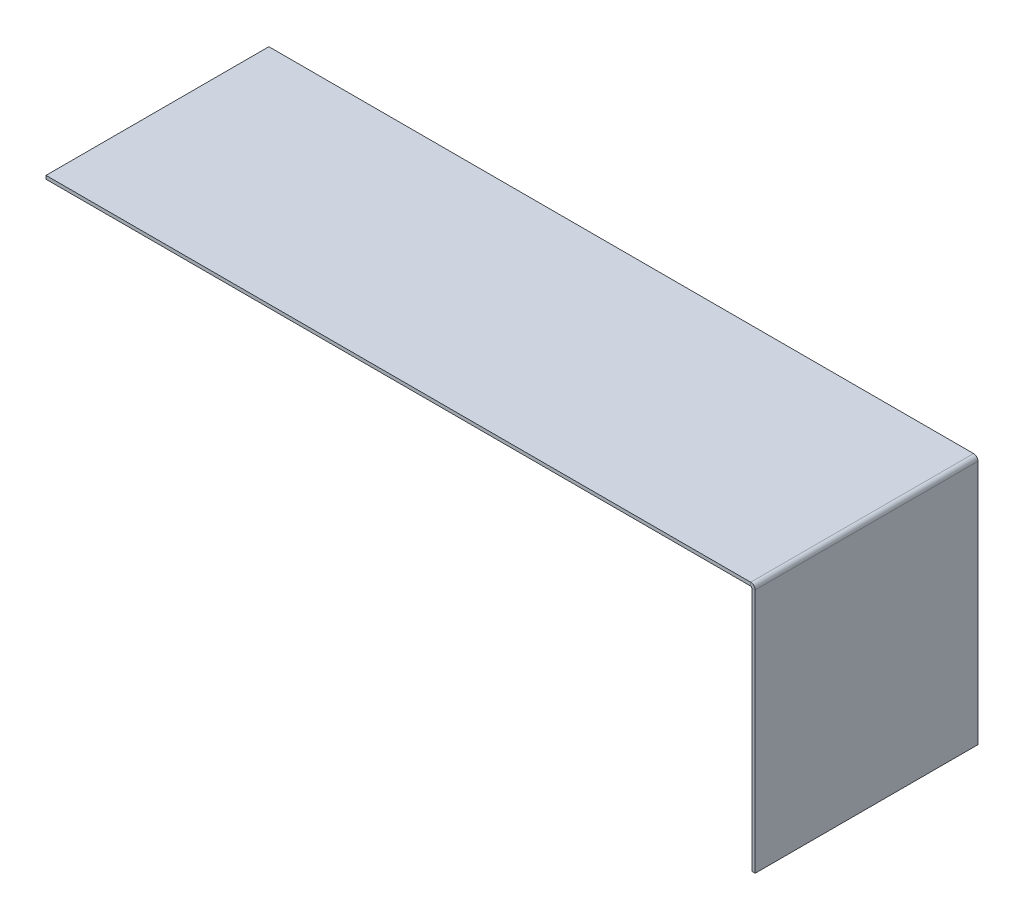
ISO-10303-21;
HEADER;
FILE_DESCRIPTION(('STEP AP214'),'2;1');
FILE_NAME('part.step','',(''),(''),'','','');
FILE_SCHEMA(('AUTOMOTIVE_DESIGN { 1 0 10303 214 1 1 1 1 }'));
ENDSEC;
DATA;
#1=APPLICATION_CONTEXT('core data for automotive mechanical design processes');
#2=APPLICATION_PROTOCOL_DEFINITION('international standard','automotive_design',2000,#1);
#3=PRODUCT_CONTEXT('',#1,'mechanical');
#4=PRODUCT('Part','Part','',(#3));
#5=PRODUCT_RELATED_PRODUCT_CATEGORY('part','',(#4));
#6=PRODUCT_DEFINITION_FORMATION('','',#4);
#7=PRODUCT_DEFINITION_CONTEXT('part definition',#1,'design');
#8=PRODUCT_DEFINITION('design','',#6,#7);
#9=PRODUCT_DEFINITION_SHAPE('','',#8);
#10=(LENGTH_UNIT() NAMED_UNIT(*) SI_UNIT(.MILLI.,.METRE.));
#11=(NAMED_UNIT(*) PLANE_ANGLE_UNIT() SI_UNIT($,.RADIAN.));
#12=(NAMED_UNIT(*) SI_UNIT($,.STERADIAN.) SOLID_ANGLE_UNIT());
#13=UNCERTAINTY_MEASURE_WITH_UNIT(LENGTH_MEASURE(1.E-05),#10,'distance_accuracy_value','');
#14=(GEOMETRIC_REPRESENTATION_CONTEXT(3) GLOBAL_UNCERTAINTY_ASSIGNED_CONTEXT((#13)) GLOBAL_UNIT_ASSIGNED_CONTEXT((#10,
#11,#12)) REPRESENTATION_CONTEXT('',''));
#15=CARTESIAN_POINT('',(0.,0.,0.));
#16=DIRECTION('',(0.,0.,1.));
#17=DIRECTION('',(1.,0.,0.));
#18=AXIS2_PLACEMENT_3D('',#15,#16,#17);
#19=CARTESIAN_POINT('',(666.75,-4.175,209.55));
#20=DIRECTION('',(0.,0.,1.));
#21=DIRECTION('',(1.,0.,0.));
#22=AXIS2_PLACEMENT_3D('',#19,#20,#21);
#23=PLANE('',#22);
#24=DIRECTION('',(-1.,0.,0.));
#25=VECTOR('',#24,1.);
#26=CARTESIAN_POINT('',(666.75,-4.175,209.55));
#27=LINE('',#26,#25);
#28=CARTESIAN_POINT('',(666.75,-4.175,209.55));
#29=VERTEX_POINT('',#28);
#30=CARTESIAN_POINT('',(663.575,-4.175,209.55));
#31=VERTEX_POINT('',#30);
#32=EDGE_CURVE('E11',#29,#31,#27,.T.);
#33=ORIENTED_EDGE('',*,*,#32,.F.);
#34=CARTESIAN_POINT('',(662.575,-4.175,209.55));
#35=DIRECTION('',(0.,0.,1.));
#36=DIRECTION('',(1.,0.,0.));
#37=AXIS2_PLACEMENT_3D('',#34,#35,#36);
#38=CIRCLE('',#37,4.175);
#39=CARTESIAN_POINT('',(662.575,0.,209.55));
#40=VERTEX_POINT('',#39);
#41=EDGE_CURVE('E131',#40,#29,#38,.F.);
#42=ORIENTED_EDGE('',*,*,#41,.F.);
#43=DIRECTION('',(0.,1.,0.));
#44=VECTOR('',#43,1.);
#45=CARTESIAN_POINT('',(662.575,-3.175,209.55));
#46=LINE('',#45,#44);
#47=CARTESIAN_POINT('',(662.575,-3.175,209.55));
#48=VERTEX_POINT('',#47);
#49=EDGE_CURVE('E42',#48,#40,#46,.T.);
#50=ORIENTED_EDGE('',*,*,#49,.F.);
#51=CARTESIAN_POINT('',(662.575,-4.175,209.55));
#52=DIRECTION('',(0.,0.,1.));
#53=DIRECTION('',(1.,0.,0.));
#54=AXIS2_PLACEMENT_3D('',#51,#52,#53);
#55=CIRCLE('',#54,1.);
#56=EDGE_CURVE('E124',#48,#31,#55,.F.);
#57=ORIENTED_EDGE('',*,*,#56,.T.);
#58=EDGE_LOOP('',(#33,#42,#50,#57));
#59=FACE_BOUND('',#58,.T.);
#60=ADVANCED_FACE('F34',(#59),#23,.T.);
#61=CARTESIAN_POINT('',(662.575,-3.175,209.55));
#62=DIRECTION('',(0.,0.,1.));
#63=DIRECTION('',(1.,0.,0.));
#64=AXIS2_PLACEMENT_3D('',#61,#62,#63);
#65=PLANE('',#64);
#66=DIRECTION('',(0.,-1.,0.));
#67=VECTOR('',#66,1.);
#68=CARTESIAN_POINT('',(666.75,0.,209.55));
#69=LINE('',#68,#67);
#70=CARTESIAN_POINT('',(666.75,-234.95,209.55));
#71=VERTEX_POINT('',#70);
#72=EDGE_CURVE('E180',#29,#71,#69,.T.);
#73=ORIENTED_EDGE('',*,*,#72,.F.);
#74=ORIENTED_EDGE('',*,*,#32,.T.);
#75=DIRECTION('',(0.,1.,0.));
#76=VECTOR('',#75,1.);
#77=CARTESIAN_POINT('',(663.575,0.,209.55));
#78=LINE('',#77,#76);
#79=CARTESIAN_POINT('',(663.575,-234.95,209.55));
#80=VERTEX_POINT('',#79);
#81=EDGE_CURVE('E90',#31,#80,#78,.F.);
#82=ORIENTED_EDGE('',*,*,#81,.T.);
#83=DIRECTION('',(-1.,0.,0.));
#84=VECTOR('',#83,1.);
#85=CARTESIAN_POINT('',(666.75,-234.95,209.55));
#86=LINE('',#85,#84);
#87=EDGE_CURVE('E337',#71,#80,#86,.T.);
#88=ORIENTED_EDGE('',*,*,#87,.F.);
#89=EDGE_LOOP('',(#73,#74,#82,#88));
#90=FACE_BOUND('',#89,.T.);
#91=ADVANCED_FACE('F188',(#90),#65,.T.);
#92=CARTESIAN_POINT('',(662.575,0.,0.));
#93=DIRECTION('',(0.,0.,-1.));
#94=DIRECTION('',(-1.,0.,0.));
#95=AXIS2_PLACEMENT_3D('',#92,#93,#94);
#96=PLANE('',#95);
#97=DIRECTION('',(0.,-1.,0.));
#98=VECTOR('',#97,1.);
#99=CARTESIAN_POINT('',(662.575,0.,0.));
#100=LINE('',#99,#98);
#101=CARTESIAN_POINT('',(662.575,0.,0.));
#102=VERTEX_POINT('',#101);
#103=CARTESIAN_POINT('',(662.575,-3.175,0.));
#104=VERTEX_POINT('',#103);
#105=EDGE_CURVE('E77',#102,#104,#100,.T.);
#106=ORIENTED_EDGE('',*,*,#105,.F.);
#107=CARTESIAN_POINT('',(662.575,-4.175,0.));
#108=DIRECTION('',(0.,0.,1.));
#109=DIRECTION('',(1.,0.,0.));
#110=AXIS2_PLACEMENT_3D('',#107,#108,#109);
#111=CIRCLE('',#110,4.175);
#112=CARTESIAN_POINT('',(666.75,-4.175,0.));
#113=VERTEX_POINT('',#112);
#114=EDGE_CURVE('E146',#102,#113,#111,.F.);
#115=ORIENTED_EDGE('',*,*,#114,.T.);
#116=DIRECTION('',(1.,0.,0.));
#117=VECTOR('',#116,1.);
#118=CARTESIAN_POINT('',(663.575,-4.175,0.));
#119=LINE('',#118,#117);
#120=CARTESIAN_POINT('',(663.575,-4.175,0.));
#121=VERTEX_POINT('',#120);
#122=EDGE_CURVE('E84',#121,#113,#119,.T.);
#123=ORIENTED_EDGE('',*,*,#122,.F.);
#124=CARTESIAN_POINT('',(662.575,-4.175,0.));
#125=DIRECTION('',(0.,0.,1.));
#126=DIRECTION('',(1.,0.,0.));
#127=AXIS2_PLACEMENT_3D('',#124,#125,#126);
#128=CIRCLE('',#127,1.);
#129=EDGE_CURVE('E153',#104,#121,#128,.F.);
#130=ORIENTED_EDGE('',*,*,#129,.F.);
#131=EDGE_LOOP('',(#106,#115,#123,#130));
#132=FACE_BOUND('',#131,.T.);
#133=ADVANCED_FACE('F186',(#132),#96,.T.);
#134=CARTESIAN_POINT('',(663.575,-4.175,0.));
#135=DIRECTION('',(0.,0.,-1.));
#136=DIRECTION('',(-1.,0.,0.));
#137=AXIS2_PLACEMENT_3D('',#134,#135,#136);
#138=PLANE('',#137);
#139=DIRECTION('',(1.,0.,0.));
#140=VECTOR('',#139,1.);
#141=CARTESIAN_POINT('',(0.,0.,0.));
#142=LINE('',#141,#140);
#143=CARTESIAN_POINT('',(0.,0.,0.));
#144=VERTEX_POINT('',#143);
#145=EDGE_CURVE('E148',#144,#102,#142,.T.);
#146=ORIENTED_EDGE('',*,*,#145,.T.);
#147=ORIENTED_EDGE('',*,*,#105,.T.);
#148=DIRECTION('',(1.,0.,0.));
#149=VECTOR('',#148,1.);
#150=CARTESIAN_POINT('',(0.,-3.175,0.));
#151=LINE('',#150,#149);
#152=CARTESIAN_POINT('',(0.,-3.175,0.));
#153=VERTEX_POINT('',#152);
#154=EDGE_CURVE('E151',#153,#104,#151,.T.);
#155=ORIENTED_EDGE('',*,*,#154,.F.);
#156=DIRECTION('',(0.,1.,0.));
#157=VECTOR('',#156,1.);
#158=CARTESIAN_POINT('',(0.,-3.175,0.));
#159=LINE('',#158,#157);
#160=EDGE_CURVE('E112',#153,#144,#159,.T.);
#161=ORIENTED_EDGE('',*,*,#160,.T.);
#162=EDGE_LOOP('',(#146,#147,#155,#161));
#163=FACE_BOUND('',#162,.T.);
#164=ADVANCED_FACE('F182',(#163),#138,.T.);
#165=CARTESIAN_POINT('',(663.575,0.,209.55));
#166=DIRECTION('',(1.,0.,0.));
#167=DIRECTION('',(0.,0.,-1.));
#168=AXIS2_PLACEMENT_3D('',#165,#166,#167);
#169=PLANE('',#168);
#170=DIRECTION('',(0.,1.,0.));
#171=VECTOR('',#170,1.);
#172=CARTESIAN_POINT('',(663.575,0.,0.));
#173=LINE('',#172,#171);
#174=CARTESIAN_POINT('',(663.575,-234.95,0.));
#175=VERTEX_POINT('',#174);
#176=EDGE_CURVE('E137',#121,#175,#173,.F.);
#177=ORIENTED_EDGE('',*,*,#176,.T.);
#178=DIRECTION('',(0.,0.,-1.));
#179=VECTOR('',#178,1.);
#180=CARTESIAN_POINT('',(663.575,-234.95,209.55));
#181=LINE('',#180,#179);
#182=EDGE_CURVE('E167',#80,#175,#181,.T.);
#183=ORIENTED_EDGE('',*,*,#182,.F.);
#184=ORIENTED_EDGE('',*,*,#81,.F.);
#185=DIRECTION('',(0.,0.,-1.));
#186=VECTOR('',#185,1.);
#187=CARTESIAN_POINT('',(663.575,-4.175,209.55));
#188=LINE('',#187,#186);
#189=EDGE_CURVE('E136',#31,#121,#188,.T.);
#190=ORIENTED_EDGE('',*,*,#189,.T.);
#191=EDGE_LOOP('',(#177,#183,#184,#190));
#192=FACE_BOUND('',#191,.T.);
#193=ADVANCED_FACE('F194',(#192),#169,.F.);
#194=CARTESIAN_POINT('',(666.75,-234.95,209.55));
#195=DIRECTION('',(0.,-1.,0.));
#196=DIRECTION('',(0.,0.,-1.));
#197=AXIS2_PLACEMENT_3D('',#194,#195,#196);
#198=PLANE('',#197);
#199=DIRECTION('',(-1.,0.,0.));
#200=VECTOR('',#199,1.);
#201=CARTESIAN_POINT('',(666.75,-234.95,0.));
#202=LINE('',#201,#200);
#203=CARTESIAN_POINT('',(666.75,-234.95,0.));
#204=VERTEX_POINT('',#203);
#205=EDGE_CURVE('E140',#204,#175,#202,.T.);
#206=ORIENTED_EDGE('',*,*,#205,.F.);
#207=DIRECTION('',(0.,0.,-1.));
#208=VECTOR('',#207,1.);
#209=CARTESIAN_POINT('',(666.75,-234.95,209.55));
#210=LINE('',#209,#208);
#211=EDGE_CURVE('E165',#71,#204,#210,.T.);
#212=ORIENTED_EDGE('',*,*,#211,.F.);
#213=ORIENTED_EDGE('',*,*,#87,.T.);
#214=ORIENTED_EDGE('',*,*,#182,.T.);
#215=EDGE_LOOP('',(#206,#212,#213,#214));
#216=FACE_BOUND('',#215,.T.);
#217=ADVANCED_FACE('F225',(#216),#198,.T.);
#218=CARTESIAN_POINT('',(666.75,0.,209.55));
#219=DIRECTION('',(1.,0.,0.));
#220=DIRECTION('',(0.,0.,-1.));
#221=AXIS2_PLACEMENT_3D('',#218,#219,#220);
#222=PLANE('',#221);
#223=DIRECTION('',(0.,-1.,0.));
#224=VECTOR('',#223,1.);
#225=CARTESIAN_POINT('',(666.75,0.,0.));
#226=LINE('',#225,#224);
#227=EDGE_CURVE('E143',#113,#204,#226,.T.);
#228=ORIENTED_EDGE('',*,*,#227,.F.);
#229=DIRECTION('',(0.,0.,-1.));
#230=VECTOR('',#229,1.);
#231=CARTESIAN_POINT('',(666.75,-4.175,209.55));
#232=LINE('',#231,#230);
#233=EDGE_CURVE('E162',#29,#113,#232,.T.);
#234=ORIENTED_EDGE('',*,*,#233,.F.);
#235=ORIENTED_EDGE('',*,*,#72,.T.);
#236=ORIENTED_EDGE('',*,*,#211,.T.);
#237=EDGE_LOOP('',(#228,#234,#235,#236));
#238=FACE_BOUND('',#237,.T.);
#239=ADVANCED_FACE('F236',(#238),#222,.T.);
#240=CARTESIAN_POINT('',(662.575,-4.175,209.55));
#241=DIRECTION('',(0.,0.,-1.));
#242=DIRECTION('',(-1.,0.,0.));
#243=AXIS2_PLACEMENT_3D('',#240,#241,#242);
#244=CYLINDRICAL_SURFACE('',#243,4.175);
#245=ORIENTED_EDGE('',*,*,#114,.F.);
#246=DIRECTION('',(0.,0.,-1.));
#247=VECTOR('',#246,1.);
#248=CARTESIAN_POINT('',(662.575,0.,209.55));
#249=LINE('',#248,#247);
#250=EDGE_CURVE('E159',#40,#102,#249,.T.);
#251=ORIENTED_EDGE('',*,*,#250,.F.);
#252=ORIENTED_EDGE('',*,*,#41,.T.);
#253=ORIENTED_EDGE('',*,*,#233,.T.);
#254=EDGE_LOOP('',(#245,#251,#252,#253));
#255=FACE_BOUND('',#254,.T.);
#256=ADVANCED_FACE('F176',(#255),#244,.T.);
#257=CARTESIAN_POINT('',(0.,0.,209.55));
#258=DIRECTION('',(0.,1.,0.));
#259=DIRECTION('',(0.,0.,1.));
#260=AXIS2_PLACEMENT_3D('',#257,#258,#259);
#261=PLANE('',#260);
#262=ORIENTED_EDGE('',*,*,#145,.F.);
#263=DIRECTION('',(0.,0.,-1.));
#264=VECTOR('',#263,1.);
#265=CARTESIAN_POINT('',(0.,0.,209.55));
#266=LINE('',#265,#264);
#267=CARTESIAN_POINT('',(0.,0.,209.55));
#268=VERTEX_POINT('',#267);
#269=EDGE_CURVE('E114',#268,#144,#266,.T.);
#270=ORIENTED_EDGE('',*,*,#269,.F.);
#271=DIRECTION('',(1.,0.,0.));
#272=VECTOR('',#271,1.);
#273=CARTESIAN_POINT('',(0.,0.,209.55));
#274=LINE('',#273,#272);
#275=EDGE_CURVE('E129',#268,#40,#274,.T.);
#276=ORIENTED_EDGE('',*,*,#275,.T.);
#277=ORIENTED_EDGE('',*,*,#250,.T.);
#278=EDGE_LOOP('',(#262,#270,#276,#277));
#279=FACE_BOUND('',#278,.T.);
#280=ADVANCED_FACE('F181',(#279),#261,.T.);
#281=CARTESIAN_POINT('',(0.,-3.175,209.55));
#282=DIRECTION('',(-1.,0.,0.));
#283=DIRECTION('',(0.,0.,1.));
#284=AXIS2_PLACEMENT_3D('',#281,#282,#283);
#285=PLANE('',#284);
#286=ORIENTED_EDGE('',*,*,#160,.F.);
#287=DIRECTION('',(0.,0.,-1.));
#288=VECTOR('',#287,1.);
#289=CARTESIAN_POINT('',(0.,-3.175,209.55));
#290=LINE('',#289,#288);
#291=CARTESIAN_POINT('',(0.,-3.175,209.55));
#292=VERTEX_POINT('',#291);
#293=EDGE_CURVE('E106',#292,#153,#290,.T.);
#294=ORIENTED_EDGE('',*,*,#293,.F.);
#295=DIRECTION('',(0.,1.,0.));
#296=VECTOR('',#295,1.);
#297=CARTESIAN_POINT('',(0.,-3.175,209.55));
#298=LINE('',#297,#296);
#299=EDGE_CURVE('E110',#292,#268,#298,.T.);
#300=ORIENTED_EDGE('',*,*,#299,.T.);
#301=ORIENTED_EDGE('',*,*,#269,.T.);
#302=EDGE_LOOP('',(#286,#294,#300,#301));
#303=FACE_BOUND('',#302,.T.);
#304=ADVANCED_FACE('F108',(#303),#285,.T.);
#305=CARTESIAN_POINT('',(0.,-3.175,209.55));
#306=DIRECTION('',(0.,1.,0.));
#307=DIRECTION('',(0.,0.,1.));
#308=AXIS2_PLACEMENT_3D('',#305,#306,#307);
#309=PLANE('',#308);
#310=ORIENTED_EDGE('',*,*,#154,.T.);
#311=DIRECTION('',(0.,0.,-1.));
#312=VECTOR('',#311,1.);
#313=CARTESIAN_POINT('',(662.575,-3.175,209.55));
#314=LINE('',#313,#312);
#315=EDGE_CURVE('E115',#48,#104,#314,.T.);
#316=ORIENTED_EDGE('',*,*,#315,.F.);
#317=DIRECTION('',(1.,0.,0.));
#318=VECTOR('',#317,1.);
#319=CARTESIAN_POINT('',(0.,-3.175,209.55));
#320=LINE('',#319,#318);
#321=EDGE_CURVE('E119',#292,#48,#320,.T.);
#322=ORIENTED_EDGE('',*,*,#321,.F.);
#323=ORIENTED_EDGE('',*,*,#293,.T.);
#324=EDGE_LOOP('',(#310,#316,#322,#323));
#325=FACE_BOUND('',#324,.T.);
#326=ADVANCED_FACE('F120',(#325),#309,.F.);
#327=CARTESIAN_POINT('',(662.575,-4.175,209.55));
#328=DIRECTION('',(0.,0.,-1.));
#329=DIRECTION('',(-1.,0.,0.));
#330=AXIS2_PLACEMENT_3D('',#327,#328,#329);
#331=CYLINDRICAL_SURFACE('',#330,1.);
#332=ORIENTED_EDGE('',*,*,#129,.T.);
#333=ORIENTED_EDGE('',*,*,#189,.F.);
#334=ORIENTED_EDGE('',*,*,#56,.F.);
#335=ORIENTED_EDGE('',*,*,#315,.T.);
#336=EDGE_LOOP('',(#332,#333,#334,#335));
#337=FACE_BOUND('',#336,.T.);
#338=ADVANCED_FACE('F184',(#337),#331,.F.);
#339=CARTESIAN_POINT('',(662.575,-4.175,209.55));
#340=DIRECTION('',(0.,0.,1.));
#341=DIRECTION('',(1.,0.,0.));
#342=AXIS2_PLACEMENT_3D('',#339,#340,#341);
#343=PLANE('',#342);
#344=ORIENTED_EDGE('',*,*,#321,.T.);
#345=ORIENTED_EDGE('',*,*,#49,.T.);
#346=ORIENTED_EDGE('',*,*,#275,.F.);
#347=ORIENTED_EDGE('',*,*,#299,.F.);
#348=EDGE_LOOP('',(#344,#345,#346,#347));
#349=FACE_BOUND('',#348,.T.);
#350=ADVANCED_FACE('F127',(#349),#343,.T.);
#351=CARTESIAN_POINT('',(662.575,-4.175,0.));
#352=DIRECTION('',(0.,0.,1.));
#353=DIRECTION('',(1.,0.,0.));
#354=AXIS2_PLACEMENT_3D('',#351,#352,#353);
#355=PLANE('',#354);
#356=ORIENTED_EDGE('',*,*,#176,.F.);
#357=ORIENTED_EDGE('',*,*,#122,.T.);
#358=ORIENTED_EDGE('',*,*,#227,.T.);
#359=ORIENTED_EDGE('',*,*,#205,.T.);
#360=EDGE_LOOP('',(#356,#357,#358,#359));
#361=FACE_BOUND('',#360,.T.);
#362=ADVANCED_FACE('F302',(#361),#355,.F.);
#363=CLOSED_SHELL('',(#60,#91,#133,#164,#193,#217,#239,#256,#280,#304,#326,#338,#350,#362));
#364=MANIFOLD_SOLID_BREP('B2',#363);
#365=ADVANCED_BREP_SHAPE_REPRESENTATION('',(#18,#364),#14);
#366=SHAPE_DEFINITION_REPRESENTATION(#9,#365);
ENDSEC;
END-ISO-10303-21;
